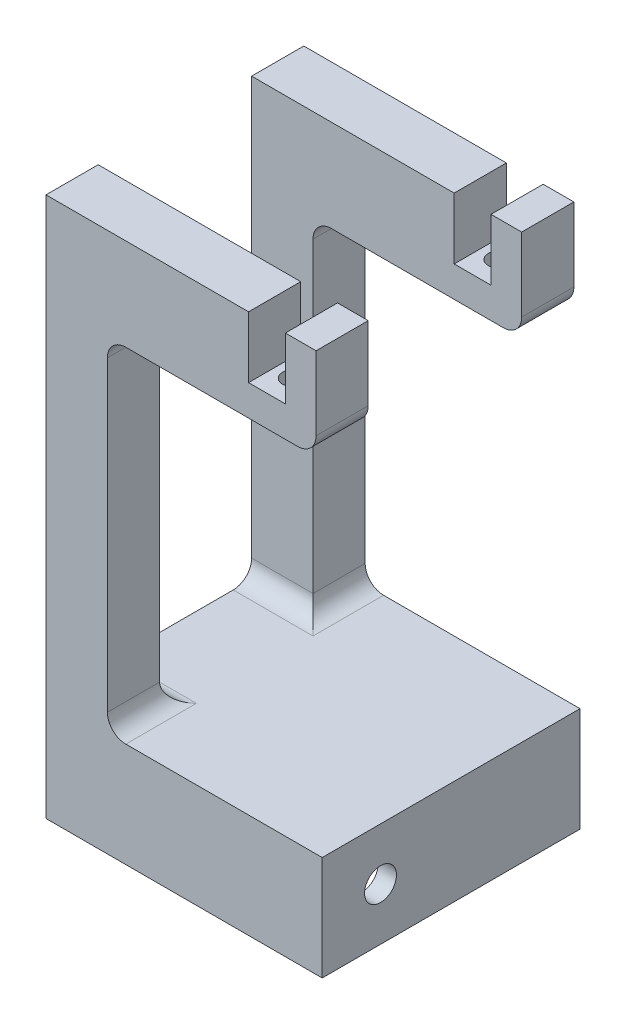
ISO-10303-21;
HEADER;
FILE_DESCRIPTION(('STEP AP214'),'2;1');
FILE_NAME('part.step','',(''),(''),'','','');
FILE_SCHEMA(('AUTOMOTIVE_DESIGN { 1 0 10303 214 1 1 1 1 }'));
ENDSEC;
DATA;
#1=APPLICATION_CONTEXT('core data for automotive mechanical design processes');
#2=APPLICATION_PROTOCOL_DEFINITION('international standard','automotive_design',2000,#1);
#3=PRODUCT_CONTEXT('',#1,'mechanical');
#4=PRODUCT('Part','Part','',(#3));
#5=PRODUCT_RELATED_PRODUCT_CATEGORY('part','',(#4));
#6=PRODUCT_DEFINITION_FORMATION('','',#4);
#7=PRODUCT_DEFINITION_CONTEXT('part definition',#1,'design');
#8=PRODUCT_DEFINITION('design','',#6,#7);
#9=PRODUCT_DEFINITION_SHAPE('','',#8);
#10=(LENGTH_UNIT() NAMED_UNIT(*) SI_UNIT(.MILLI.,.METRE.));
#11=(NAMED_UNIT(*) PLANE_ANGLE_UNIT() SI_UNIT($,.RADIAN.));
#12=(NAMED_UNIT(*) SI_UNIT($,.STERADIAN.) SOLID_ANGLE_UNIT());
#13=UNCERTAINTY_MEASURE_WITH_UNIT(LENGTH_MEASURE(1.E-05),#10,'distance_accuracy_value','');
#14=(GEOMETRIC_REPRESENTATION_CONTEXT(3) GLOBAL_UNCERTAINTY_ASSIGNED_CONTEXT((#13)) GLOBAL_UNIT_ASSIGNED_CONTEXT((#10,
#11,#12)) REPRESENTATION_CONTEXT('',''));
#15=CARTESIAN_POINT('',(0.,0.,0.));
#16=DIRECTION('',(0.,0.,1.));
#17=DIRECTION('',(1.,0.,0.));
#18=AXIS2_PLACEMENT_3D('',#15,#16,#17);
#19=CARTESIAN_POINT('',(10.,17.,42.));
#20=DIRECTION('',(-1.,0.,0.));
#21=DIRECTION('',(0.,0.,1.));
#22=AXIS2_PLACEMENT_3D('',#19,#20,#21);
#23=PLANE('',#22);
#24=DIRECTION('',(0.,1.,0.));
#25=VECTOR('',#24,1.);
#26=CARTESIAN_POINT('',(10.,17.,0.));
#27=LINE('',#26,#25);
#28=CARTESIAN_POINT('',(10.,20.,0.));
#29=VERTEX_POINT('',#28);
#30=CARTESIAN_POINT('',(10.,70.,0.));
#31=VERTEX_POINT('',#30);
#32=EDGE_CURVE('E396',#29,#31,#27,.T.);
#33=ORIENTED_EDGE('',*,*,#32,.T.);
#34=DIRECTION('',(0.,0.,-1.));
#35=VECTOR('',#34,1.);
#36=CARTESIAN_POINT('',(10.,70.,8.50000000000001));
#37=LINE('',#36,#35);
#38=CARTESIAN_POINT('',(10.,70.,8.5));
#39=VERTEX_POINT('',#38);
#40=EDGE_CURVE('E511',#31,#39,#37,.F.);
#41=ORIENTED_EDGE('',*,*,#40,.T.);
#42=DIRECTION('',(0.,-1.,0.));
#43=VECTOR('',#42,1.);
#44=CARTESIAN_POINT('',(10.,17.,8.50000000000001));
#45=LINE('',#44,#43);
#46=CARTESIAN_POINT('',(10.,20.,8.50000000000001));
#47=VERTEX_POINT('',#46);
#48=EDGE_CURVE('E354',#39,#47,#45,.T.);
#49=ORIENTED_EDGE('',*,*,#48,.T.);
#50=DIRECTION('',(0.,0.,-1.));
#51=VECTOR('',#50,1.);
#52=CARTESIAN_POINT('',(10.,20.,0.));
#53=LINE('',#52,#51);
#54=EDGE_CURVE('E472',#47,#29,#53,.T.);
#55=ORIENTED_EDGE('',*,*,#54,.T.);
#56=EDGE_LOOP('',(#33,#41,#49,#55));
#57=FACE_BOUND('',#56,.T.);
#58=ADVANCED_FACE('F39',(#57),#23,.F.);
#59=CARTESIAN_POINT('',(10.,73.,42.));
#60=DIRECTION('',(0.,1.,0.));
#61=DIRECTION('',(0.,0.,1.));
#62=AXIS2_PLACEMENT_3D('',#59,#60,#61);
#63=PLANE('',#62);
#64=CARTESIAN_POINT('',(36.,73.,4.25));
#65=DIRECTION('',(0.,1.,0.));
#66=DIRECTION('',(0.,0.,1.));
#67=AXIS2_PLACEMENT_3D('',#64,#65,#66);
#68=CIRCLE('',#67,1.7);
#69=CARTESIAN_POINT('',(36.,73.,5.95));
#70=VERTEX_POINT('',#69);
#71=EDGE_CURVE('E297',#70,#70,#68,.F.);
#72=ORIENTED_EDGE('',*,*,#71,.F.);
#73=EDGE_LOOP('',(#72));
#74=FACE_BOUND('',#73,.T.);
#75=DIRECTION('',(1.,0.,0.));
#76=VECTOR('',#75,1.);
#77=CARTESIAN_POINT('',(10.,73.,0.));
#78=LINE('',#77,#76);
#79=CARTESIAN_POINT('',(13.,73.,0.));
#80=VERTEX_POINT('',#79);
#81=CARTESIAN_POINT('',(41.,73.,0.));
#82=VERTEX_POINT('',#81);
#83=EDGE_CURVE('E399',#80,#82,#78,.T.);
#84=ORIENTED_EDGE('',*,*,#83,.T.);
#85=DIRECTION('',(0.,0.,-1.));
#86=VECTOR('',#85,1.);
#87=CARTESIAN_POINT('',(41.,73.,42.));
#88=LINE('',#87,#86);
#89=CARTESIAN_POINT('',(41.,73.,8.50000000000001));
#90=VERTEX_POINT('',#89);
#91=EDGE_CURVE('E494',#82,#90,#88,.F.);
#92=ORIENTED_EDGE('',*,*,#91,.T.);
#93=DIRECTION('',(-1.,0.,0.));
#94=VECTOR('',#93,1.);
#95=CARTESIAN_POINT('',(10.,73.,8.50000000000001));
#96=LINE('',#95,#94);
#97=CARTESIAN_POINT('',(13.,73.,8.50000000000001));
#98=VERTEX_POINT('',#97);
#99=EDGE_CURVE('E351',#90,#98,#96,.T.);
#100=ORIENTED_EDGE('',*,*,#99,.T.);
#101=DIRECTION('',(0.,0.,-1.));
#102=VECTOR('',#101,1.);
#103=CARTESIAN_POINT('',(13.,73.,0.));
#104=LINE('',#103,#102);
#105=EDGE_CURVE('E491',#98,#80,#104,.T.);
#106=ORIENTED_EDGE('',*,*,#105,.T.);
#107=EDGE_LOOP('',(#84,#92,#100,#106));
#108=FACE_BOUND('',#107,.T.);
#109=ADVANCED_FACE('F535',(#74,#108),#63,.F.);
#110=CARTESIAN_POINT('',(44.,88.,42.));
#111=DIRECTION('',(-1.,0.,0.));
#112=DIRECTION('',(0.,0.,1.));
#113=AXIS2_PLACEMENT_3D('',#110,#111,#112);
#114=PLANE('',#113);
#115=DIRECTION('',(0.,-1.,0.));
#116=VECTOR('',#115,1.);
#117=CARTESIAN_POINT('',(44.,88.,8.50000000000001));
#118=LINE('',#117,#116);
#119=CARTESIAN_POINT('',(44.,88.,8.5));
#120=VERTEX_POINT('',#119);
#121=CARTESIAN_POINT('',(44.,76.,8.50000000000001));
#122=VERTEX_POINT('',#121);
#123=EDGE_CURVE('E348',#120,#122,#118,.T.);
#124=ORIENTED_EDGE('',*,*,#123,.T.);
#125=DIRECTION('',(0.,0.,-1.));
#126=VECTOR('',#125,1.);
#127=CARTESIAN_POINT('',(44.,76.,42.));
#128=LINE('',#127,#126);
#129=CARTESIAN_POINT('',(44.,76.,0.));
#130=VERTEX_POINT('',#129);
#131=EDGE_CURVE('E482',#122,#130,#128,.T.);
#132=ORIENTED_EDGE('',*,*,#131,.T.);
#133=DIRECTION('',(0.,1.,0.));
#134=VECTOR('',#133,1.);
#135=CARTESIAN_POINT('',(44.,88.,0.));
#136=LINE('',#135,#134);
#137=CARTESIAN_POINT('',(44.,88.,0.));
#138=VERTEX_POINT('',#137);
#139=EDGE_CURVE('E402',#130,#138,#136,.T.);
#140=ORIENTED_EDGE('',*,*,#139,.T.);
#141=DIRECTION('',(0.,0.,-1.));
#142=VECTOR('',#141,1.);
#143=CARTESIAN_POINT('',(44.,88.,42.));
#144=LINE('',#143,#142);
#145=EDGE_CURVE('E437',#120,#138,#144,.T.);
#146=ORIENTED_EDGE('',*,*,#145,.F.);
#147=EDGE_LOOP('',(#124,#132,#140,#146));
#148=FACE_BOUND('',#147,.T.);
#149=ADVANCED_FACE('F543',(#148),#114,.F.);
#150=CARTESIAN_POINT('',(39.,88.,42.));
#151=DIRECTION('',(0.,-1.,0.));
#152=DIRECTION('',(0.,0.,-1.));
#153=AXIS2_PLACEMENT_3D('',#150,#151,#152);
#154=PLANE('',#153);
#155=DIRECTION('',(0.,0.,-1.));
#156=VECTOR('',#155,1.);
#157=CARTESIAN_POINT('',(39.,88.,42.));
#158=LINE('',#157,#156);
#159=CARTESIAN_POINT('',(39.,88.,8.5));
#160=VERTEX_POINT('',#159);
#161=CARTESIAN_POINT('',(39.,88.,0.));
#162=VERTEX_POINT('',#161);
#163=EDGE_CURVE('E433',#160,#162,#158,.T.);
#164=ORIENTED_EDGE('',*,*,#163,.F.);
#165=DIRECTION('',(-1.,0.,0.));
#166=VECTOR('',#165,1.);
#167=CARTESIAN_POINT('',(45.,88.,8.5));
#168=LINE('',#167,#166);
#169=EDGE_CURVE('E319',#120,#160,#168,.T.);
#170=ORIENTED_EDGE('',*,*,#169,.F.);
#171=ORIENTED_EDGE('',*,*,#145,.T.);
#172=DIRECTION('',(-1.,0.,0.));
#173=VECTOR('',#172,1.);
#174=CARTESIAN_POINT('',(39.,88.,0.));
#175=LINE('',#174,#173);
#176=EDGE_CURVE('E404',#138,#162,#175,.T.);
#177=ORIENTED_EDGE('',*,*,#176,.T.);
#178=EDGE_LOOP('',(#164,#170,#171,#177));
#179=FACE_BOUND('',#178,.T.);
#180=ADVANCED_FACE('F548',(#179),#154,.F.);
#181=CARTESIAN_POINT('',(39.,88.,42.));
#182=DIRECTION('',(1.,0.,0.));
#183=DIRECTION('',(0.,0.,-1.));
#184=AXIS2_PLACEMENT_3D('',#181,#182,#183);
#185=PLANE('',#184);
#186=DIRECTION('',(0.,0.,-1.));
#187=VECTOR('',#186,1.);
#188=CARTESIAN_POINT('',(39.,78.,42.));
#189=LINE('',#188,#187);
#190=CARTESIAN_POINT('',(39.,78.,8.50000000000001));
#191=VERTEX_POINT('',#190);
#192=CARTESIAN_POINT('',(39.,78.,0.));
#193=VERTEX_POINT('',#192);
#194=EDGE_CURVE('E429',#191,#193,#189,.T.);
#195=ORIENTED_EDGE('',*,*,#194,.F.);
#196=DIRECTION('',(0.,1.,0.));
#197=VECTOR('',#196,1.);
#198=CARTESIAN_POINT('',(39.,88.,8.50000000000001));
#199=LINE('',#198,#197);
#200=EDGE_CURVE('E345',#191,#160,#199,.T.);
#201=ORIENTED_EDGE('',*,*,#200,.T.);
#202=ORIENTED_EDGE('',*,*,#163,.T.);
#203=DIRECTION('',(0.,-1.,0.));
#204=VECTOR('',#203,1.);
#205=CARTESIAN_POINT('',(39.,88.,0.));
#206=LINE('',#205,#204);
#207=EDGE_CURVE('E407',#162,#193,#206,.T.);
#208=ORIENTED_EDGE('',*,*,#207,.T.);
#209=EDGE_LOOP('',(#195,#201,#202,#208));
#210=FACE_BOUND('',#209,.T.);
#211=ADVANCED_FACE('F554',(#210),#185,.F.);
#212=CARTESIAN_POINT('',(33.,78.,42.));
#213=DIRECTION('',(0.,-1.,0.));
#214=DIRECTION('',(0.,0.,-1.));
#215=AXIS2_PLACEMENT_3D('',#212,#213,#214);
#216=PLANE('',#215);
#217=CARTESIAN_POINT('',(36.,78.,4.25));
#218=DIRECTION('',(0.,1.,0.));
#219=DIRECTION('',(0.,0.,-1.));
#220=AXIS2_PLACEMENT_3D('',#217,#218,#219);
#221=CIRCLE('',#220,1.7);
#222=CARTESIAN_POINT('',(36.,78.,2.55));
#223=VERTEX_POINT('',#222);
#224=EDGE_CURVE('E303',#223,#223,#221,.T.);
#225=ORIENTED_EDGE('',*,*,#224,.F.);
#226=EDGE_LOOP('',(#225));
#227=FACE_BOUND('',#226,.T.);
#228=DIRECTION('',(0.,0.,-1.));
#229=VECTOR('',#228,1.);
#230=CARTESIAN_POINT('',(33.,78.,42.));
#231=LINE('',#230,#229);
#232=CARTESIAN_POINT('',(33.,78.,8.50000000000001));
#233=VERTEX_POINT('',#232);
#234=CARTESIAN_POINT('',(33.,78.,0.));
#235=VERTEX_POINT('',#234);
#236=EDGE_CURVE('E425',#233,#235,#231,.T.);
#237=ORIENTED_EDGE('',*,*,#236,.F.);
#238=DIRECTION('',(1.,0.,0.));
#239=VECTOR('',#238,1.);
#240=CARTESIAN_POINT('',(33.,78.,8.50000000000001));
#241=LINE('',#240,#239);
#242=EDGE_CURVE('E342',#233,#191,#241,.T.);
#243=ORIENTED_EDGE('',*,*,#242,.T.);
#244=ORIENTED_EDGE('',*,*,#194,.T.);
#245=DIRECTION('',(-1.,0.,0.));
#246=VECTOR('',#245,1.);
#247=CARTESIAN_POINT('',(33.,78.,0.));
#248=LINE('',#247,#246);
#249=EDGE_CURVE('E410',#193,#235,#248,.T.);
#250=ORIENTED_EDGE('',*,*,#249,.T.);
#251=EDGE_LOOP('',(#237,#243,#244,#250));
#252=FACE_BOUND('',#251,.T.);
#253=ADVANCED_FACE('F557',(#227,#252),#216,.F.);
#254=CARTESIAN_POINT('',(33.,88.,42.));
#255=DIRECTION('',(-1.,0.,0.));
#256=DIRECTION('',(0.,0.,1.));
#257=AXIS2_PLACEMENT_3D('',#254,#255,#256);
#258=PLANE('',#257);
#259=DIRECTION('',(0.,0.,-1.));
#260=VECTOR('',#259,1.);
#261=CARTESIAN_POINT('',(33.,88.,42.));
#262=LINE('',#261,#260);
#263=CARTESIAN_POINT('',(33.,88.,8.5));
#264=VERTEX_POINT('',#263);
#265=CARTESIAN_POINT('',(33.,88.,0.));
#266=VERTEX_POINT('',#265);
#267=EDGE_CURVE('E421',#264,#266,#262,.T.);
#268=ORIENTED_EDGE('',*,*,#267,.F.);
#269=DIRECTION('',(0.,-1.,0.));
#270=VECTOR('',#269,1.);
#271=CARTESIAN_POINT('',(33.,88.,8.50000000000001));
#272=LINE('',#271,#270);
#273=EDGE_CURVE('E339',#264,#233,#272,.T.);
#274=ORIENTED_EDGE('',*,*,#273,.T.);
#275=ORIENTED_EDGE('',*,*,#236,.T.);
#276=DIRECTION('',(0.,1.,0.));
#277=VECTOR('',#276,1.);
#278=CARTESIAN_POINT('',(33.,88.,0.));
#279=LINE('',#278,#277);
#280=EDGE_CURVE('E413',#235,#266,#279,.T.);
#281=ORIENTED_EDGE('',*,*,#280,.T.);
#282=EDGE_LOOP('',(#268,#274,#275,#281));
#283=FACE_BOUND('',#282,.T.);
#284=ADVANCED_FACE('F560',(#283),#258,.F.);
#285=CARTESIAN_POINT('',(0.,88.,42.));
#286=DIRECTION('',(0.,-1.,0.));
#287=DIRECTION('',(0.,0.,-1.));
#288=AXIS2_PLACEMENT_3D('',#285,#286,#287);
#289=PLANE('',#288);
#290=DIRECTION('',(0.,0.,-1.));
#291=VECTOR('',#290,1.);
#292=CARTESIAN_POINT('',(0.,88.,42.));
#293=LINE('',#292,#291);
#294=CARTESIAN_POINT('',(0.,88.,8.5));
#295=VERTEX_POINT('',#294);
#296=CARTESIAN_POINT('',(0.,88.,0.));
#297=VERTEX_POINT('',#296);
#298=EDGE_CURVE('E385',#295,#297,#293,.T.);
#299=ORIENTED_EDGE('',*,*,#298,.F.);
#300=DIRECTION('',(1.,0.,0.));
#301=VECTOR('',#300,1.);
#302=CARTESIAN_POINT('',(0.,88.,8.50000000000001));
#303=LINE('',#302,#301);
#304=EDGE_CURVE('E452',#295,#264,#303,.T.);
#305=ORIENTED_EDGE('',*,*,#304,.T.);
#306=ORIENTED_EDGE('',*,*,#267,.T.);
#307=DIRECTION('',(-1.,0.,0.));
#308=VECTOR('',#307,1.);
#309=CARTESIAN_POINT('',(0.,88.,0.));
#310=LINE('',#309,#308);
#311=EDGE_CURVE('E361',#266,#297,#310,.T.);
#312=ORIENTED_EDGE('',*,*,#311,.T.);
#313=EDGE_LOOP('',(#299,#305,#306,#312));
#314=FACE_BOUND('',#313,.T.);
#315=ADVANCED_FACE('F565',(#314),#289,.F.);
#316=CARTESIAN_POINT('',(0.,0.,42.));
#317=DIRECTION('',(1.,0.,0.));
#318=DIRECTION('',(0.,0.,-1.));
#319=AXIS2_PLACEMENT_3D('',#316,#317,#318);
#320=PLANE('',#319);
#321=DIRECTION('',(0.,0.,1.));
#322=VECTOR('',#321,1.);
#323=CARTESIAN_POINT('',(0.,17.,8.50000000000001));
#324=LINE('',#323,#322);
#325=CARTESIAN_POINT('',(0.,17.,11.5));
#326=VERTEX_POINT('',#325);
#327=CARTESIAN_POINT('',(0.,17.,30.5));
#328=VERTEX_POINT('',#327);
#329=EDGE_CURVE('E313',#326,#328,#324,.T.);
#330=ORIENTED_EDGE('',*,*,#329,.F.);
#331=CARTESIAN_POINT('',(0.,20.,11.5));
#332=DIRECTION('',(1.,0.,0.));
#333=DIRECTION('',(0.,0.,-1.));
#334=AXIS2_PLACEMENT_3D('',#331,#332,#333);
#335=CIRCLE('',#334,3.);
#336=CARTESIAN_POINT('',(0.,20.,8.50000000000001));
#337=VERTEX_POINT('',#336);
#338=EDGE_CURVE('E478',#326,#337,#335,.T.);
#339=ORIENTED_EDGE('',*,*,#338,.T.);
#340=DIRECTION('',(0.,-1.,0.));
#341=VECTOR('',#340,1.);
#342=CARTESIAN_POINT('',(0.,88.,8.5));
#343=LINE('',#342,#341);
#344=EDGE_CURVE('E306',#295,#337,#343,.T.);
#345=ORIENTED_EDGE('',*,*,#344,.F.);
#346=ORIENTED_EDGE('',*,*,#298,.T.);
#347=DIRECTION('',(0.,-1.,0.));
#348=VECTOR('',#347,1.);
#349=CARTESIAN_POINT('',(0.,0.,0.));
#350=LINE('',#349,#348);
#351=CARTESIAN_POINT('',(0.,0.,0.));
#352=VERTEX_POINT('',#351);
#353=EDGE_CURVE('E356',#297,#352,#350,.T.);
#354=ORIENTED_EDGE('',*,*,#353,.T.);
#355=DIRECTION('',(0.,0.,-1.));
#356=VECTOR('',#355,1.);
#357=CARTESIAN_POINT('',(0.,0.,42.));
#358=LINE('',#357,#356);
#359=CARTESIAN_POINT('',(0.,0.,42.));
#360=VERTEX_POINT('',#359);
#361=EDGE_CURVE('E446',#360,#352,#358,.T.);
#362=ORIENTED_EDGE('',*,*,#361,.F.);
#363=DIRECTION('',(0.,-1.,0.));
#364=VECTOR('',#363,1.);
#365=CARTESIAN_POINT('',(0.,0.,42.));
#366=LINE('',#365,#364);
#367=CARTESIAN_POINT('',(0.,88.,42.));
#368=VERTEX_POINT('',#367);
#369=EDGE_CURVE('E357',#368,#360,#366,.T.);
#370=ORIENTED_EDGE('',*,*,#369,.F.);
#371=CARTESIAN_POINT('',(0.,88.,33.5));
#372=VERTEX_POINT('',#371);
#373=EDGE_CURVE('E418',#368,#372,#293,.T.);
#374=ORIENTED_EDGE('',*,*,#373,.T.);
#375=DIRECTION('',(0.,1.,0.));
#376=VECTOR('',#375,1.);
#377=CARTESIAN_POINT('',(0.,88.,33.5));
#378=LINE('',#377,#376);
#379=CARTESIAN_POINT('',(0.,20.,33.5));
#380=VERTEX_POINT('',#379);
#381=EDGE_CURVE('E316',#380,#372,#378,.T.);
#382=ORIENTED_EDGE('',*,*,#381,.F.);
#383=CARTESIAN_POINT('',(0.,20.,30.5));
#384=DIRECTION('',(1.,0.,0.));
#385=DIRECTION('',(0.,0.,-1.));
#386=AXIS2_PLACEMENT_3D('',#383,#384,#385);
#387=CIRCLE('',#386,3.);
#388=EDGE_CURVE('E476',#380,#328,#387,.T.);
#389=ORIENTED_EDGE('',*,*,#388,.T.);
#390=EDGE_LOOP('',(#330,#339,#345,#346,#354,#362,#370,#374,#382,#389));
#391=FACE_BOUND('',#390,.T.);
#392=ADVANCED_FACE('F569',(#391),#320,.F.);
#393=CARTESIAN_POINT('',(0.,0.,42.));
#394=DIRECTION('',(0.,1.,0.));
#395=DIRECTION('',(0.,0.,1.));
#396=AXIS2_PLACEMENT_3D('',#393,#394,#395);
#397=PLANE('',#396);
#398=DIRECTION('',(1.,0.,0.));
#399=VECTOR('',#398,1.);
#400=CARTESIAN_POINT('',(3.,0.,3.));
#401=LINE('',#400,#399);
#402=CARTESIAN_POINT('',(3.,0.,3.));
#403=VERTEX_POINT('',#402);
#404=CARTESIAN_POINT('',(42.,0.,3.));
#405=VERTEX_POINT('',#404);
#406=EDGE_CURVE('E285',#403,#405,#401,.T.);
#407=ORIENTED_EDGE('',*,*,#406,.F.);
#408=DIRECTION('',(0.,0.,-1.));
#409=VECTOR('',#408,1.);
#410=CARTESIAN_POINT('',(3.,0.,39.));
#411=LINE('',#410,#409);
#412=CARTESIAN_POINT('',(3.,0.,39.));
#413=VERTEX_POINT('',#412);
#414=EDGE_CURVE('E55',#413,#403,#411,.T.);
#415=ORIENTED_EDGE('',*,*,#414,.F.);
#416=DIRECTION('',(-1.,0.,0.));
#417=VECTOR('',#416,1.);
#418=CARTESIAN_POINT('',(42.,0.,39.));
#419=LINE('',#418,#417);
#420=CARTESIAN_POINT('',(42.,0.,39.));
#421=VERTEX_POINT('',#420);
#422=EDGE_CURVE('E276',#421,#413,#419,.T.);
#423=ORIENTED_EDGE('',*,*,#422,.F.);
#424=DIRECTION('',(0.,0.,1.));
#425=VECTOR('',#424,1.);
#426=CARTESIAN_POINT('',(42.,0.,3.));
#427=LINE('',#426,#425);
#428=EDGE_CURVE('E279',#405,#421,#427,.T.);
#429=ORIENTED_EDGE('',*,*,#428,.F.);
#430=EDGE_LOOP('',(#407,#415,#423,#429));
#431=FACE_BOUND('',#430,.T.);
#432=DIRECTION('',(1.,0.,0.));
#433=VECTOR('',#432,1.);
#434=CARTESIAN_POINT('',(0.,0.,0.));
#435=LINE('',#434,#433);
#436=CARTESIAN_POINT('',(45.,0.,0.));
#437=VERTEX_POINT('',#436);
#438=EDGE_CURVE('E388',#352,#437,#435,.T.);
#439=ORIENTED_EDGE('',*,*,#438,.T.);
#440=DIRECTION('',(0.,0.,-1.));
#441=VECTOR('',#440,1.);
#442=CARTESIAN_POINT('',(45.,0.,42.));
#443=LINE('',#442,#441);
#444=CARTESIAN_POINT('',(45.,0.,42.));
#445=VERTEX_POINT('',#444);
#446=EDGE_CURVE('E443',#445,#437,#443,.T.);
#447=ORIENTED_EDGE('',*,*,#446,.F.);
#448=DIRECTION('',(1.,0.,0.));
#449=VECTOR('',#448,1.);
#450=CARTESIAN_POINT('',(0.,0.,42.));
#451=LINE('',#450,#449);
#452=EDGE_CURVE('E360',#360,#445,#451,.T.);
#453=ORIENTED_EDGE('',*,*,#452,.F.);
#454=ORIENTED_EDGE('',*,*,#361,.T.);
#455=EDGE_LOOP('',(#439,#447,#453,#454));
#456=FACE_BOUND('',#455,.T.);
#457=ADVANCED_FACE('F590',(#431,#456),#397,.F.);
#458=CARTESIAN_POINT('',(45.,17.,42.));
#459=DIRECTION('',(-1.,0.,0.));
#460=DIRECTION('',(0.,0.,1.));
#461=AXIS2_PLACEMENT_3D('',#458,#459,#460);
#462=PLANE('',#461);
#463=CARTESIAN_POINT('',(45.,8.5,32.5));
#464=DIRECTION('',(1.,0.,0.));
#465=DIRECTION('',(0.,0.,-1.));
#466=AXIS2_PLACEMENT_3D('',#463,#464,#465);
#467=CIRCLE('',#466,2.6);
#468=CARTESIAN_POINT('',(45.,8.5,29.9));
#469=VERTEX_POINT('',#468);
#470=EDGE_CURVE('E294',#469,#469,#467,.T.);
#471=ORIENTED_EDGE('',*,*,#470,.F.);
#472=EDGE_LOOP('',(#471));
#473=FACE_BOUND('',#472,.T.);
#474=DIRECTION('',(0.,1.,0.));
#475=VECTOR('',#474,1.);
#476=CARTESIAN_POINT('',(45.,17.,0.));
#477=LINE('',#476,#475);
#478=CARTESIAN_POINT('',(45.,17.,0.));
#479=VERTEX_POINT('',#478);
#480=EDGE_CURVE('E390',#437,#479,#477,.T.);
#481=ORIENTED_EDGE('',*,*,#480,.T.);
#482=DIRECTION('',(0.,0.,-1.));
#483=VECTOR('',#482,1.);
#484=CARTESIAN_POINT('',(45.,17.,42.));
#485=LINE('',#484,#483);
#486=CARTESIAN_POINT('',(45.,17.,42.));
#487=VERTEX_POINT('',#486);
#488=EDGE_CURVE('E441',#487,#479,#485,.T.);
#489=ORIENTED_EDGE('',*,*,#488,.F.);
#490=DIRECTION('',(0.,1.,0.));
#491=VECTOR('',#490,1.);
#492=CARTESIAN_POINT('',(45.,17.,42.));
#493=LINE('',#492,#491);
#494=EDGE_CURVE('E363',#445,#487,#493,.T.);
#495=ORIENTED_EDGE('',*,*,#494,.F.);
#496=ORIENTED_EDGE('',*,*,#446,.T.);
#497=EDGE_LOOP('',(#481,#489,#495,#496));
#498=FACE_BOUND('',#497,.T.);
#499=ADVANCED_FACE('F587',(#473,#498),#462,.F.);
#500=CARTESIAN_POINT('',(10.,17.,42.));
#501=DIRECTION('',(0.,-1.,0.));
#502=DIRECTION('',(0.,0.,-1.));
#503=AXIS2_PLACEMENT_3D('',#500,#501,#502);
#504=PLANE('',#503);
#505=DIRECTION('',(-1.,0.,0.));
#506=VECTOR('',#505,1.);
#507=CARTESIAN_POINT('',(10.,17.,30.5));
#508=LINE('',#507,#506);
#509=CARTESIAN_POINT('',(13.,17.,30.5));
#510=VERTEX_POINT('',#509);
#511=EDGE_CURVE('E463',#328,#510,#508,.F.);
#512=ORIENTED_EDGE('',*,*,#511,.T.);
#513=DIRECTION('',(0.,0.,-1.));
#514=VECTOR('',#513,1.);
#515=CARTESIAN_POINT('',(13.,17.,42.));
#516=LINE('',#515,#514);
#517=CARTESIAN_POINT('',(13.,17.,42.));
#518=VERTEX_POINT('',#517);
#519=EDGE_CURVE('E465',#510,#518,#516,.F.);
#520=ORIENTED_EDGE('',*,*,#519,.T.);
#521=DIRECTION('',(-1.,0.,0.));
#522=VECTOR('',#521,1.);
#523=CARTESIAN_POINT('',(10.,17.,42.));
#524=LINE('',#523,#522);
#525=EDGE_CURVE('E365',#487,#518,#524,.T.);
#526=ORIENTED_EDGE('',*,*,#525,.F.);
#527=ORIENTED_EDGE('',*,*,#488,.T.);
#528=DIRECTION('',(-1.,0.,0.));
#529=VECTOR('',#528,1.);
#530=CARTESIAN_POINT('',(10.,17.,0.));
#531=LINE('',#530,#529);
#532=CARTESIAN_POINT('',(13.,17.,0.));
#533=VERTEX_POINT('',#532);
#534=EDGE_CURVE('E393',#479,#533,#531,.T.);
#535=ORIENTED_EDGE('',*,*,#534,.T.);
#536=DIRECTION('',(0.,0.,-1.));
#537=VECTOR('',#536,1.);
#538=CARTESIAN_POINT('',(13.,17.,8.50000000000001));
#539=LINE('',#538,#537);
#540=CARTESIAN_POINT('',(13.,17.,11.5));
#541=VERTEX_POINT('',#540);
#542=EDGE_CURVE('E458',#533,#541,#539,.F.);
#543=ORIENTED_EDGE('',*,*,#542,.T.);
#544=DIRECTION('',(-1.,0.,0.));
#545=VECTOR('',#544,1.);
#546=CARTESIAN_POINT('',(0.,17.,11.5));
#547=LINE('',#546,#545);
#548=EDGE_CURVE('E460',#541,#326,#547,.T.);
#549=ORIENTED_EDGE('',*,*,#548,.T.);
#550=ORIENTED_EDGE('',*,*,#329,.T.);
#551=EDGE_LOOP('',(#512,#520,#526,#527,#535,#543,#549,#550));
#552=FACE_BOUND('',#551,.T.);
#553=ADVANCED_FACE('F582',(#552),#504,.F.);
#554=DIRECTION('',(0.,1.,0.));
#555=VECTOR('',#554,1.);
#556=CARTESIAN_POINT('',(10.,17.,33.5));
#557=LINE('',#556,#555);
#558=CARTESIAN_POINT('',(10.,20.,33.5));
#559=VERTEX_POINT('',#558);
#560=CARTESIAN_POINT('',(10.,70.,33.5));
#561=VERTEX_POINT('',#560);
#562=EDGE_CURVE('E337',#559,#561,#557,.T.);
#563=ORIENTED_EDGE('',*,*,#562,.T.);
#564=DIRECTION('',(0.,0.,-1.));
#565=VECTOR('',#564,1.);
#566=CARTESIAN_POINT('',(10.,70.,42.));
#567=LINE('',#566,#565);
#568=CARTESIAN_POINT('',(10.,70.,42.));
#569=VERTEX_POINT('',#568);
#570=EDGE_CURVE('E63',#561,#569,#567,.F.);
#571=ORIENTED_EDGE('',*,*,#570,.T.);
#572=DIRECTION('',(0.,1.,0.));
#573=VECTOR('',#572,1.);
#574=CARTESIAN_POINT('',(10.,17.,42.));
#575=LINE('',#574,#573);
#576=CARTESIAN_POINT('',(10.,20.,42.));
#577=VERTEX_POINT('',#576);
#578=EDGE_CURVE('E368',#577,#569,#575,.T.);
#579=ORIENTED_EDGE('',*,*,#578,.F.);
#580=DIRECTION('',(0.,0.,-1.));
#581=VECTOR('',#580,1.);
#582=CARTESIAN_POINT('',(10.,20.,33.5));
#583=LINE('',#582,#581);
#584=EDGE_CURVE('E455',#577,#559,#583,.T.);
#585=ORIENTED_EDGE('',*,*,#584,.T.);
#586=EDGE_LOOP('',(#563,#571,#579,#585));
#587=FACE_BOUND('',#586,.T.);
#588=ADVANCED_FACE('F637',(#587),#23,.F.);
#589=CARTESIAN_POINT('',(36.,73.,37.75));
#590=DIRECTION('',(0.,1.,0.));
#591=DIRECTION('',(0.,0.,1.));
#592=AXIS2_PLACEMENT_3D('',#589,#590,#591);
#593=CIRCLE('',#592,1.7);
#594=CARTESIAN_POINT('',(36.,73.,39.45));
#595=VERTEX_POINT('',#594);
#596=EDGE_CURVE('E299',#595,#595,#593,.F.);
#597=ORIENTED_EDGE('',*,*,#596,.F.);
#598=EDGE_LOOP('',(#597));
#599=FACE_BOUND('',#598,.T.);
#600=DIRECTION('',(1.,0.,0.));
#601=VECTOR('',#600,1.);
#602=CARTESIAN_POINT('',(10.,73.,33.5));
#603=LINE('',#602,#601);
#604=CARTESIAN_POINT('',(13.,73.,33.5));
#605=VERTEX_POINT('',#604);
#606=CARTESIAN_POINT('',(41.,73.,33.5));
#607=VERTEX_POINT('',#606);
#608=EDGE_CURVE('E334',#605,#607,#603,.T.);
#609=ORIENTED_EDGE('',*,*,#608,.T.);
#610=DIRECTION('',(0.,0.,-1.));
#611=VECTOR('',#610,1.);
#612=CARTESIAN_POINT('',(41.,73.,42.));
#613=LINE('',#612,#611);
#614=CARTESIAN_POINT('',(41.,73.,42.));
#615=VERTEX_POINT('',#614);
#616=EDGE_CURVE('E506',#607,#615,#613,.F.);
#617=ORIENTED_EDGE('',*,*,#616,.T.);
#618=DIRECTION('',(1.,0.,0.));
#619=VECTOR('',#618,1.);
#620=CARTESIAN_POINT('',(10.,73.,42.));
#621=LINE('',#620,#619);
#622=CARTESIAN_POINT('',(13.,73.,42.));
#623=VERTEX_POINT('',#622);
#624=EDGE_CURVE('E370',#623,#615,#621,.T.);
#625=ORIENTED_EDGE('',*,*,#624,.F.);
#626=DIRECTION('',(0.,0.,-1.));
#627=VECTOR('',#626,1.);
#628=CARTESIAN_POINT('',(13.,73.,33.5));
#629=LINE('',#628,#627);
#630=EDGE_CURVE('E503',#623,#605,#629,.T.);
#631=ORIENTED_EDGE('',*,*,#630,.T.);
#632=EDGE_LOOP('',(#609,#617,#625,#631));
#633=FACE_BOUND('',#632,.T.);
#634=ADVANCED_FACE('F631',(#599,#633),#63,.F.);
#635=DIRECTION('',(0.,1.,0.));
#636=VECTOR('',#635,1.);
#637=CARTESIAN_POINT('',(44.,88.,42.));
#638=LINE('',#637,#636);
#639=CARTESIAN_POINT('',(44.,76.,42.));
#640=VERTEX_POINT('',#639);
#641=CARTESIAN_POINT('',(44.,88.,42.));
#642=VERTEX_POINT('',#641);
#643=EDGE_CURVE('E373',#640,#642,#638,.T.);
#644=ORIENTED_EDGE('',*,*,#643,.F.);
#645=DIRECTION('',(0.,0.,-1.));
#646=VECTOR('',#645,1.);
#647=CARTESIAN_POINT('',(44.,76.,42.));
#648=LINE('',#647,#646);
#649=CARTESIAN_POINT('',(44.,76.,33.5));
#650=VERTEX_POINT('',#649);
#651=EDGE_CURVE('E498',#640,#650,#648,.T.);
#652=ORIENTED_EDGE('',*,*,#651,.T.);
#653=DIRECTION('',(0.,1.,0.));
#654=VECTOR('',#653,1.);
#655=CARTESIAN_POINT('',(44.,88.,33.5));
#656=LINE('',#655,#654);
#657=CARTESIAN_POINT('',(44.,88.,33.5));
#658=VERTEX_POINT('',#657);
#659=EDGE_CURVE('E332',#650,#658,#656,.T.);
#660=ORIENTED_EDGE('',*,*,#659,.T.);
#661=EDGE_CURVE('E438',#642,#658,#144,.T.);
#662=ORIENTED_EDGE('',*,*,#661,.F.);
#663=EDGE_LOOP('',(#644,#652,#660,#662));
#664=FACE_BOUND('',#663,.T.);
#665=ADVANCED_FACE('F623',(#664),#114,.F.);
#666=ORIENTED_EDGE('',*,*,#661,.T.);
#667=DIRECTION('',(-1.,0.,0.));
#668=VECTOR('',#667,1.);
#669=CARTESIAN_POINT('',(45.,88.,33.5));
#670=LINE('',#669,#668);
#671=CARTESIAN_POINT('',(39.,88.,33.5));
#672=VERTEX_POINT('',#671);
#673=EDGE_CURVE('E318',#658,#672,#670,.T.);
#674=ORIENTED_EDGE('',*,*,#673,.T.);
#675=CARTESIAN_POINT('',(39.,88.,42.));
#676=VERTEX_POINT('',#675);
#677=EDGE_CURVE('E434',#676,#672,#158,.T.);
#678=ORIENTED_EDGE('',*,*,#677,.F.);
#679=DIRECTION('',(-1.,0.,0.));
#680=VECTOR('',#679,1.);
#681=CARTESIAN_POINT('',(39.,88.,42.));
#682=LINE('',#681,#680);
#683=EDGE_CURVE('E375',#642,#676,#682,.T.);
#684=ORIENTED_EDGE('',*,*,#683,.F.);
#685=EDGE_LOOP('',(#666,#674,#678,#684));
#686=FACE_BOUND('',#685,.T.);
#687=ADVANCED_FACE('F618',(#686),#154,.F.);
#688=ORIENTED_EDGE('',*,*,#677,.T.);
#689=DIRECTION('',(0.,-1.,0.));
#690=VECTOR('',#689,1.);
#691=CARTESIAN_POINT('',(39.,88.,33.5));
#692=LINE('',#691,#690);
#693=CARTESIAN_POINT('',(39.,78.,33.5));
#694=VERTEX_POINT('',#693);
#695=EDGE_CURVE('E329',#672,#694,#692,.T.);
#696=ORIENTED_EDGE('',*,*,#695,.T.);
#697=CARTESIAN_POINT('',(39.,78.,42.));
#698=VERTEX_POINT('',#697);
#699=EDGE_CURVE('E430',#698,#694,#189,.T.);
#700=ORIENTED_EDGE('',*,*,#699,.F.);
#701=DIRECTION('',(0.,-1.,0.));
#702=VECTOR('',#701,1.);
#703=CARTESIAN_POINT('',(39.,88.,42.));
#704=LINE('',#703,#702);
#705=EDGE_CURVE('E377',#676,#698,#704,.T.);
#706=ORIENTED_EDGE('',*,*,#705,.F.);
#707=EDGE_LOOP('',(#688,#696,#700,#706));
#708=FACE_BOUND('',#707,.T.);
#709=ADVANCED_FACE('F613',(#708),#185,.F.);
#710=CARTESIAN_POINT('',(36.,78.,37.75));
#711=DIRECTION('',(0.,1.,0.));
#712=DIRECTION('',(0.,0.,1.));
#713=AXIS2_PLACEMENT_3D('',#710,#711,#712);
#714=CIRCLE('',#713,1.7);
#715=CARTESIAN_POINT('',(36.,78.,39.45));
#716=VERTEX_POINT('',#715);
#717=EDGE_CURVE('E302',#716,#716,#714,.T.);
#718=ORIENTED_EDGE('',*,*,#717,.F.);
#719=EDGE_LOOP('',(#718));
#720=FACE_BOUND('',#719,.T.);
#721=ORIENTED_EDGE('',*,*,#699,.T.);
#722=DIRECTION('',(-1.,0.,0.));
#723=VECTOR('',#722,1.);
#724=CARTESIAN_POINT('',(33.,78.,33.5));
#725=LINE('',#724,#723);
#726=CARTESIAN_POINT('',(33.,78.,33.5));
#727=VERTEX_POINT('',#726);
#728=EDGE_CURVE('E326',#694,#727,#725,.T.);
#729=ORIENTED_EDGE('',*,*,#728,.T.);
#730=CARTESIAN_POINT('',(33.,78.,42.));
#731=VERTEX_POINT('',#730);
#732=EDGE_CURVE('E426',#731,#727,#231,.T.);
#733=ORIENTED_EDGE('',*,*,#732,.F.);
#734=DIRECTION('',(-1.,0.,0.));
#735=VECTOR('',#734,1.);
#736=CARTESIAN_POINT('',(33.,78.,42.));
#737=LINE('',#736,#735);
#738=EDGE_CURVE('E379',#698,#731,#737,.T.);
#739=ORIENTED_EDGE('',*,*,#738,.F.);
#740=EDGE_LOOP('',(#721,#729,#733,#739));
#741=FACE_BOUND('',#740,.T.);
#742=ADVANCED_FACE('F609',(#720,#741),#216,.F.);
#743=ORIENTED_EDGE('',*,*,#732,.T.);
#744=DIRECTION('',(0.,1.,0.));
#745=VECTOR('',#744,1.);
#746=CARTESIAN_POINT('',(33.,88.,33.5));
#747=LINE('',#746,#745);
#748=CARTESIAN_POINT('',(33.,88.,33.5));
#749=VERTEX_POINT('',#748);
#750=EDGE_CURVE('E321',#727,#749,#747,.T.);
#751=ORIENTED_EDGE('',*,*,#750,.T.);
#752=CARTESIAN_POINT('',(33.,88.,42.));
#753=VERTEX_POINT('',#752);
#754=EDGE_CURVE('E422',#753,#749,#262,.T.);
#755=ORIENTED_EDGE('',*,*,#754,.F.);
#756=DIRECTION('',(0.,1.,0.));
#757=VECTOR('',#756,1.);
#758=CARTESIAN_POINT('',(33.,88.,42.));
#759=LINE('',#758,#757);
#760=EDGE_CURVE('E381',#731,#753,#759,.T.);
#761=ORIENTED_EDGE('',*,*,#760,.F.);
#762=EDGE_LOOP('',(#743,#751,#755,#761));
#763=FACE_BOUND('',#762,.T.);
#764=ADVANCED_FACE('F605',(#763),#258,.F.);
#765=ORIENTED_EDGE('',*,*,#754,.T.);
#766=DIRECTION('',(-1.,0.,0.));
#767=VECTOR('',#766,1.);
#768=CARTESIAN_POINT('',(0.,88.,33.5));
#769=LINE('',#768,#767);
#770=EDGE_CURVE('E449',#749,#372,#769,.T.);
#771=ORIENTED_EDGE('',*,*,#770,.T.);
#772=ORIENTED_EDGE('',*,*,#373,.F.);
#773=DIRECTION('',(-1.,0.,0.));
#774=VECTOR('',#773,1.);
#775=CARTESIAN_POINT('',(0.,88.,42.));
#776=LINE('',#775,#774);
#777=EDGE_CURVE('E383',#753,#368,#776,.T.);
#778=ORIENTED_EDGE('',*,*,#777,.F.);
#779=EDGE_LOOP('',(#765,#771,#772,#778));
#780=FACE_BOUND('',#779,.T.);
#781=ADVANCED_FACE('F600',(#780),#289,.F.);
#782=CARTESIAN_POINT('',(0.,0.,42.));
#783=DIRECTION('',(0.,0.,-1.));
#784=DIRECTION('',(-1.,0.,0.));
#785=AXIS2_PLACEMENT_3D('',#782,#783,#784);
#786=PLANE('',#785);
#787=ORIENTED_EDGE('',*,*,#624,.T.);
#788=CARTESIAN_POINT('',(41.,76.,42.));
#789=DIRECTION('',(0.,0.,-1.));
#790=DIRECTION('',(-1.,0.,0.));
#791=AXIS2_PLACEMENT_3D('',#788,#789,#790);
#792=CIRCLE('',#791,3.);
#793=EDGE_CURVE('E508',#615,#640,#792,.F.);
#794=ORIENTED_EDGE('',*,*,#793,.T.);
#795=ORIENTED_EDGE('',*,*,#643,.T.);
#796=ORIENTED_EDGE('',*,*,#683,.T.);
#797=ORIENTED_EDGE('',*,*,#705,.T.);
#798=ORIENTED_EDGE('',*,*,#738,.T.);
#799=ORIENTED_EDGE('',*,*,#760,.T.);
#800=ORIENTED_EDGE('',*,*,#777,.T.);
#801=ORIENTED_EDGE('',*,*,#369,.T.);
#802=ORIENTED_EDGE('',*,*,#452,.T.);
#803=ORIENTED_EDGE('',*,*,#494,.T.);
#804=ORIENTED_EDGE('',*,*,#525,.T.);
#805=CARTESIAN_POINT('',(13.,20.,42.));
#806=DIRECTION('',(0.,0.,-1.));
#807=DIRECTION('',(-1.,0.,0.));
#808=AXIS2_PLACEMENT_3D('',#805,#806,#807);
#809=CIRCLE('',#808,3.);
#810=EDGE_CURVE('E474',#518,#577,#809,.T.);
#811=ORIENTED_EDGE('',*,*,#810,.T.);
#812=ORIENTED_EDGE('',*,*,#578,.T.);
#813=CARTESIAN_POINT('',(13.,70.,42.));
#814=DIRECTION('',(0.,0.,-1.));
#815=DIRECTION('',(-1.,0.,0.));
#816=AXIS2_PLACEMENT_3D('',#813,#814,#815);
#817=CIRCLE('',#816,3.);
#818=EDGE_CURVE('E515',#569,#623,#817,.T.);
#819=ORIENTED_EDGE('',*,*,#818,.T.);
#820=EDGE_LOOP('',(#787,#794,#795,#796,#797,#798,#799,#800,#801,#802,#803,#804,#811,#812,#819));
#821=FACE_BOUND('',#820,.T.);
#822=ADVANCED_FACE('F595',(#821),#786,.F.);
#823=CARTESIAN_POINT('',(0.,0.,0.));
#824=DIRECTION('',(0.,0.,-1.));
#825=DIRECTION('',(-1.,0.,0.));
#826=AXIS2_PLACEMENT_3D('',#823,#824,#825);
#827=PLANE('',#826);
#828=ORIENTED_EDGE('',*,*,#139,.F.);
#829=CARTESIAN_POINT('',(41.,76.,0.));
#830=DIRECTION('',(0.,0.,-1.));
#831=DIRECTION('',(-1.,0.,0.));
#832=AXIS2_PLACEMENT_3D('',#829,#830,#831);
#833=CIRCLE('',#832,3.);
#834=EDGE_CURVE('E489',#130,#82,#833,.T.);
#835=ORIENTED_EDGE('',*,*,#834,.T.);
#836=ORIENTED_EDGE('',*,*,#83,.F.);
#837=CARTESIAN_POINT('',(13.,70.,0.));
#838=DIRECTION('',(0.,0.,-1.));
#839=DIRECTION('',(-1.,0.,0.));
#840=AXIS2_PLACEMENT_3D('',#837,#838,#839);
#841=CIRCLE('',#840,3.);
#842=EDGE_CURVE('E48',#80,#31,#841,.F.);
#843=ORIENTED_EDGE('',*,*,#842,.T.);
#844=ORIENTED_EDGE('',*,*,#32,.F.);
#845=CARTESIAN_POINT('',(13.,20.,0.));
#846=DIRECTION('',(0.,0.,-1.));
#847=DIRECTION('',(-1.,0.,0.));
#848=AXIS2_PLACEMENT_3D('',#845,#846,#847);
#849=CIRCLE('',#848,3.);
#850=EDGE_CURVE('E480',#29,#533,#849,.F.);
#851=ORIENTED_EDGE('',*,*,#850,.T.);
#852=ORIENTED_EDGE('',*,*,#534,.F.);
#853=ORIENTED_EDGE('',*,*,#480,.F.);
#854=ORIENTED_EDGE('',*,*,#438,.F.);
#855=ORIENTED_EDGE('',*,*,#353,.F.);
#856=ORIENTED_EDGE('',*,*,#311,.F.);
#857=ORIENTED_EDGE('',*,*,#280,.F.);
#858=ORIENTED_EDGE('',*,*,#249,.F.);
#859=ORIENTED_EDGE('',*,*,#207,.F.);
#860=ORIENTED_EDGE('',*,*,#176,.F.);
#861=EDGE_LOOP('',(#828,#835,#836,#843,#844,#851,#852,#853,#854,#855,#856,#857,#858,#859,#860));
#862=FACE_BOUND('',#861,.T.);
#863=ADVANCED_FACE('F521',(#862),#827,.T.);
#864=CARTESIAN_POINT('',(45.,88.,8.5));
#865=DIRECTION('',(0.,0.,-1.));
#866=DIRECTION('',(0.,1.,0.));
#867=AXIS2_PLACEMENT_3D('',#864,#865,#866);
#868=PLANE('',#867);
#869=ORIENTED_EDGE('',*,*,#99,.F.);
#870=CARTESIAN_POINT('',(41.,76.,8.5));
#871=DIRECTION('',(0.,0.,-1.));
#872=DIRECTION('',(0.,1.,0.));
#873=AXIS2_PLACEMENT_3D('',#870,#871,#872);
#874=CIRCLE('',#873,3.);
#875=EDGE_CURVE('E496',#90,#122,#874,.F.);
#876=ORIENTED_EDGE('',*,*,#875,.T.);
#877=ORIENTED_EDGE('',*,*,#123,.F.);
#878=ORIENTED_EDGE('',*,*,#169,.T.);
#879=ORIENTED_EDGE('',*,*,#200,.F.);
#880=ORIENTED_EDGE('',*,*,#242,.F.);
#881=ORIENTED_EDGE('',*,*,#273,.F.);
#882=ORIENTED_EDGE('',*,*,#304,.F.);
#883=ORIENTED_EDGE('',*,*,#344,.T.);
#884=DIRECTION('',(-1.,0.,0.));
#885=VECTOR('',#884,1.);
#886=CARTESIAN_POINT('',(10.,20.,8.50000000000001));
#887=LINE('',#886,#885);
#888=EDGE_CURVE('E469',#337,#47,#887,.F.);
#889=ORIENTED_EDGE('',*,*,#888,.T.);
#890=ORIENTED_EDGE('',*,*,#48,.F.);
#891=CARTESIAN_POINT('',(13.,70.,8.5));
#892=DIRECTION('',(0.,0.,-1.));
#893=DIRECTION('',(0.,1.,0.));
#894=AXIS2_PLACEMENT_3D('',#891,#892,#893);
#895=CIRCLE('',#894,3.);
#896=EDGE_CURVE('E11',#39,#98,#895,.T.);
#897=ORIENTED_EDGE('',*,*,#896,.T.);
#898=EDGE_LOOP('',(#869,#876,#877,#878,#879,#880,#881,#882,#883,#889,#890,#897));
#899=FACE_BOUND('',#898,.T.);
#900=ADVANCED_FACE('F532',(#899),#868,.F.);
#901=CARTESIAN_POINT('',(45.,88.,33.5));
#902=DIRECTION('',(0.,0.,1.));
#903=DIRECTION('',(0.,-1.,0.));
#904=AXIS2_PLACEMENT_3D('',#901,#902,#903);
#905=PLANE('',#904);
#906=ORIENTED_EDGE('',*,*,#659,.F.);
#907=CARTESIAN_POINT('',(41.,76.,33.5));
#908=DIRECTION('',(0.,0.,1.));
#909=DIRECTION('',(0.,-1.,0.));
#910=AXIS2_PLACEMENT_3D('',#907,#908,#909);
#911=CIRCLE('',#910,3.);
#912=EDGE_CURVE('E501',#650,#607,#911,.F.);
#913=ORIENTED_EDGE('',*,*,#912,.T.);
#914=ORIENTED_EDGE('',*,*,#608,.F.);
#915=CARTESIAN_POINT('',(13.,70.,33.5));
#916=DIRECTION('',(0.,0.,1.));
#917=DIRECTION('',(0.,-1.,0.));
#918=AXIS2_PLACEMENT_3D('',#915,#916,#917);
#919=CIRCLE('',#918,3.);
#920=EDGE_CURVE('E513',#605,#561,#919,.T.);
#921=ORIENTED_EDGE('',*,*,#920,.T.);
#922=ORIENTED_EDGE('',*,*,#562,.F.);
#923=DIRECTION('',(-1.,0.,0.));
#924=VECTOR('',#923,1.);
#925=CARTESIAN_POINT('',(0.,20.,33.5));
#926=LINE('',#925,#924);
#927=EDGE_CURVE('E467',#559,#380,#926,.T.);
#928=ORIENTED_EDGE('',*,*,#927,.T.);
#929=ORIENTED_EDGE('',*,*,#381,.T.);
#930=ORIENTED_EDGE('',*,*,#770,.F.);
#931=ORIENTED_EDGE('',*,*,#750,.F.);
#932=ORIENTED_EDGE('',*,*,#728,.F.);
#933=ORIENTED_EDGE('',*,*,#695,.F.);
#934=ORIENTED_EDGE('',*,*,#673,.F.);
#935=EDGE_LOOP('',(#906,#913,#914,#921,#922,#928,#929,#930,#931,#932,#933,#934));
#936=FACE_BOUND('',#935,.T.);
#937=ADVANCED_FACE('F603',(#936),#905,.F.);
#938=CARTESIAN_POINT('',(36.,-0.001000000000001,37.75));
#939=DIRECTION('',(0.,1.,0.));
#940=DIRECTION('',(0.,0.,1.));
#941=AXIS2_PLACEMENT_3D('',#938,#939,#940);
#942=CYLINDRICAL_SURFACE('',#941,1.7);
#943=ORIENTED_EDGE('',*,*,#717,.T.);
#944=EDGE_LOOP('',(#943));
#945=FACE_BOUND('',#944,.T.);
#946=ORIENTED_EDGE('',*,*,#596,.T.);
#947=EDGE_LOOP('',(#946));
#948=FACE_BOUND('',#947,.T.);
#949=ADVANCED_FACE('F730',(#945,#948),#942,.F.);
#950=CARTESIAN_POINT('',(36.,-0.001000000000001,4.25));
#951=DIRECTION('',(0.,1.,0.));
#952=DIRECTION('',(0.,0.,1.));
#953=AXIS2_PLACEMENT_3D('',#950,#951,#952);
#954=CYLINDRICAL_SURFACE('',#953,1.7);
#955=ORIENTED_EDGE('',*,*,#224,.T.);
#956=EDGE_LOOP('',(#955));
#957=FACE_BOUND('',#956,.T.);
#958=ORIENTED_EDGE('',*,*,#71,.T.);
#959=EDGE_LOOP('',(#958));
#960=FACE_BOUND('',#959,.T.);
#961=ADVANCED_FACE('F657',(#957,#960),#954,.F.);
#962=CARTESIAN_POINT('',(35.,8.5,32.5));
#963=DIRECTION('',(1.,0.,0.));
#964=DIRECTION('',(0.,0.,-1.));
#965=AXIS2_PLACEMENT_3D('',#962,#963,#964);
#966=CYLINDRICAL_SURFACE('',#965,2.6);
#967=CARTESIAN_POINT('',(42.,8.5,32.5));
#968=DIRECTION('',(1.,0.,0.));
#969=DIRECTION('',(0.,0.,-1.));
#970=AXIS2_PLACEMENT_3D('',#967,#968,#969);
#971=CIRCLE('',#970,2.6);
#972=CARTESIAN_POINT('',(42.,8.5,29.9));
#973=VERTEX_POINT('',#972);
#974=EDGE_CURVE('E43',#973,#973,#971,.F.);
#975=ORIENTED_EDGE('',*,*,#974,.T.);
#976=EDGE_LOOP('',(#975));
#977=FACE_BOUND('',#976,.T.);
#978=ORIENTED_EDGE('',*,*,#470,.T.);
#979=EDGE_LOOP('',(#978));
#980=FACE_BOUND('',#979,.T.);
#981=ADVANCED_FACE('F650',(#977,#980),#966,.F.);
#982=CARTESIAN_POINT('',(45.,20.,30.5));
#983=DIRECTION('',(1.,0.,0.));
#984=DIRECTION('',(0.,0.,-1.));
#985=AXIS2_PLACEMENT_3D('',#982,#983,#984);
#986=CYLINDRICAL_SURFACE('',#985,3.);
#987=ORIENTED_EDGE('',*,*,#388,.F.);
#988=ORIENTED_EDGE('',*,*,#927,.F.);
#989=CARTESIAN_POINT('',(13.,20.,30.5));
#990=DIRECTION('',(0.707106781186547,0.,0.707106781186547));
#991=DIRECTION('',(0.707106781186547,0.,-0.707106781186547));
#992=AXIS2_PLACEMENT_3D('',#989,#990,#991);
#993=ELLIPSE('',#992,4.24264068711928,3.);
#994=EDGE_CURVE('E298',#510,#559,#993,.F.);
#995=ORIENTED_EDGE('',*,*,#994,.F.);
#996=ORIENTED_EDGE('',*,*,#511,.F.);
#997=EDGE_LOOP('',(#987,#988,#995,#996));
#998=FACE_BOUND('',#997,.T.);
#999=ADVANCED_FACE('F648',(#998),#986,.F.);
#1000=CARTESIAN_POINT('',(13.,20.,42.));
#1001=DIRECTION('',(0.,0.,1.));
#1002=DIRECTION('',(1.,0.,0.));
#1003=AXIS2_PLACEMENT_3D('',#1000,#1001,#1002);
#1004=CYLINDRICAL_SURFACE('',#1003,3.);
#1005=ORIENTED_EDGE('',*,*,#810,.F.);
#1006=ORIENTED_EDGE('',*,*,#519,.F.);
#1007=ORIENTED_EDGE('',*,*,#994,.T.);
#1008=ORIENTED_EDGE('',*,*,#584,.F.);
#1009=EDGE_LOOP('',(#1005,#1006,#1007,#1008));
#1010=FACE_BOUND('',#1009,.T.);
#1011=ADVANCED_FACE('F641',(#1010),#1004,.F.);
#1012=CARTESIAN_POINT('',(13.,20.,42.));
#1013=DIRECTION('',(0.,0.,1.));
#1014=DIRECTION('',(1.,0.,0.));
#1015=AXIS2_PLACEMENT_3D('',#1012,#1013,#1014);
#1016=CYLINDRICAL_SURFACE('',#1015,3.);
#1017=ORIENTED_EDGE('',*,*,#850,.F.);
#1018=ORIENTED_EDGE('',*,*,#54,.F.);
#1019=CARTESIAN_POINT('',(13.,20.,11.5));
#1020=DIRECTION('',(-0.707106781186547,0.,0.707106781186547));
#1021=DIRECTION('',(0.707106781186547,0.,0.707106781186547));
#1022=AXIS2_PLACEMENT_3D('',#1019,#1020,#1021);
#1023=ELLIPSE('',#1022,4.24264068711928,3.);
#1024=EDGE_CURVE('E484',#541,#47,#1023,.F.);
#1025=ORIENTED_EDGE('',*,*,#1024,.F.);
#1026=ORIENTED_EDGE('',*,*,#542,.F.);
#1027=EDGE_LOOP('',(#1017,#1018,#1025,#1026));
#1028=FACE_BOUND('',#1027,.T.);
#1029=ADVANCED_FACE('F578',(#1028),#1016,.F.);
#1030=CARTESIAN_POINT('',(10.,20.,11.5));
#1031=DIRECTION('',(1.,0.,0.));
#1032=DIRECTION('',(0.,0.,-1.));
#1033=AXIS2_PLACEMENT_3D('',#1030,#1031,#1032);
#1034=CYLINDRICAL_SURFACE('',#1033,3.);
#1035=ORIENTED_EDGE('',*,*,#1024,.T.);
#1036=ORIENTED_EDGE('',*,*,#888,.F.);
#1037=ORIENTED_EDGE('',*,*,#338,.F.);
#1038=ORIENTED_EDGE('',*,*,#548,.F.);
#1039=EDGE_LOOP('',(#1035,#1036,#1037,#1038));
#1040=FACE_BOUND('',#1039,.T.);
#1041=ADVANCED_FACE('F573',(#1040),#1034,.F.);
#1042=CARTESIAN_POINT('',(41.,76.,42.));
#1043=DIRECTION('',(0.,0.,-1.));
#1044=DIRECTION('',(-1.,0.,0.));
#1045=AXIS2_PLACEMENT_3D('',#1042,#1043,#1044);
#1046=CYLINDRICAL_SURFACE('',#1045,3.);
#1047=ORIENTED_EDGE('',*,*,#875,.F.);
#1048=ORIENTED_EDGE('',*,*,#91,.F.);
#1049=ORIENTED_EDGE('',*,*,#834,.F.);
#1050=ORIENTED_EDGE('',*,*,#131,.F.);
#1051=EDGE_LOOP('',(#1047,#1048,#1049,#1050));
#1052=FACE_BOUND('',#1051,.T.);
#1053=ADVANCED_FACE('F538',(#1052),#1046,.T.);
#1054=CARTESIAN_POINT('',(41.,76.,42.));
#1055=DIRECTION('',(0.,0.,-1.));
#1056=DIRECTION('',(-1.,0.,0.));
#1057=AXIS2_PLACEMENT_3D('',#1054,#1055,#1056);
#1058=CYLINDRICAL_SURFACE('',#1057,3.);
#1059=ORIENTED_EDGE('',*,*,#793,.F.);
#1060=ORIENTED_EDGE('',*,*,#616,.F.);
#1061=ORIENTED_EDGE('',*,*,#912,.F.);
#1062=ORIENTED_EDGE('',*,*,#651,.F.);
#1063=EDGE_LOOP('',(#1059,#1060,#1061,#1062));
#1064=FACE_BOUND('',#1063,.T.);
#1065=ADVANCED_FACE('F627',(#1064),#1058,.T.);
#1066=CARTESIAN_POINT('',(13.,70.,42.));
#1067=DIRECTION('',(0.,0.,1.));
#1068=DIRECTION('',(1.,0.,0.));
#1069=AXIS2_PLACEMENT_3D('',#1066,#1067,#1068);
#1070=CYLINDRICAL_SURFACE('',#1069,3.);
#1071=ORIENTED_EDGE('',*,*,#818,.F.);
#1072=ORIENTED_EDGE('',*,*,#570,.F.);
#1073=ORIENTED_EDGE('',*,*,#920,.F.);
#1074=ORIENTED_EDGE('',*,*,#630,.F.);
#1075=EDGE_LOOP('',(#1071,#1072,#1073,#1074));
#1076=FACE_BOUND('',#1075,.T.);
#1077=ADVANCED_FACE('F635',(#1076),#1070,.F.);
#1078=CARTESIAN_POINT('',(13.,70.,42.));
#1079=DIRECTION('',(0.,0.,1.));
#1080=DIRECTION('',(1.,0.,0.));
#1081=AXIS2_PLACEMENT_3D('',#1078,#1079,#1080);
#1082=CYLINDRICAL_SURFACE('',#1081,3.);
#1083=ORIENTED_EDGE('',*,*,#896,.F.);
#1084=ORIENTED_EDGE('',*,*,#40,.F.);
#1085=ORIENTED_EDGE('',*,*,#842,.F.);
#1086=ORIENTED_EDGE('',*,*,#105,.F.);
#1087=EDGE_LOOP('',(#1083,#1084,#1085,#1086));
#1088=FACE_BOUND('',#1087,.T.);
#1089=ADVANCED_FACE('F41',(#1088),#1082,.F.);
#1090=CARTESIAN_POINT('',(42.,14.,3.));
#1091=DIRECTION('',(1.,0.,0.));
#1092=DIRECTION('',(0.,0.,-1.));
#1093=AXIS2_PLACEMENT_3D('',#1090,#1091,#1092);
#1094=PLANE('',#1093);
#1095=ORIENTED_EDGE('',*,*,#428,.T.);
#1096=DIRECTION('',(0.,-1.,0.));
#1097=VECTOR('',#1096,1.);
#1098=CARTESIAN_POINT('',(42.,14.,39.));
#1099=LINE('',#1098,#1097);
#1100=CARTESIAN_POINT('',(42.,14.,39.));
#1101=VERTEX_POINT('',#1100);
#1102=EDGE_CURVE('E291',#1101,#421,#1099,.T.);
#1103=ORIENTED_EDGE('',*,*,#1102,.F.);
#1104=DIRECTION('',(0.,0.,1.));
#1105=VECTOR('',#1104,1.);
#1106=CARTESIAN_POINT('',(42.,14.,3.));
#1107=LINE('',#1106,#1105);
#1108=CARTESIAN_POINT('',(42.,14.,3.));
#1109=VERTEX_POINT('',#1108);
#1110=EDGE_CURVE('E272',#1109,#1101,#1107,.T.);
#1111=ORIENTED_EDGE('',*,*,#1110,.F.);
#1112=DIRECTION('',(0.,-1.,0.));
#1113=VECTOR('',#1112,1.);
#1114=CARTESIAN_POINT('',(42.,14.,3.));
#1115=LINE('',#1114,#1113);
#1116=EDGE_CURVE('E263',#1109,#405,#1115,.T.);
#1117=ORIENTED_EDGE('',*,*,#1116,.T.);
#1118=EDGE_LOOP('',(#1095,#1103,#1111,#1117));
#1119=FACE_BOUND('',#1118,.T.);
#1120=ORIENTED_EDGE('',*,*,#974,.F.);
#1121=EDGE_LOOP('',(#1120));
#1122=FACE_BOUND('',#1121,.T.);
#1123=ADVANCED_FACE('F832',(#1119,#1122),#1094,.F.);
#1124=CARTESIAN_POINT('',(3.,14.,39.));
#1125=DIRECTION('',(-1.,0.,0.));
#1126=DIRECTION('',(0.,0.,1.));
#1127=AXIS2_PLACEMENT_3D('',#1124,#1125,#1126);
#1128=PLANE('',#1127);
#1129=ORIENTED_EDGE('',*,*,#414,.T.);
#1130=DIRECTION('',(0.,-1.,0.));
#1131=VECTOR('',#1130,1.);
#1132=CARTESIAN_POINT('',(3.,14.,3.));
#1133=LINE('',#1132,#1131);
#1134=CARTESIAN_POINT('',(3.,14.,3.));
#1135=VERTEX_POINT('',#1134);
#1136=EDGE_CURVE('E254',#1135,#403,#1133,.T.);
#1137=ORIENTED_EDGE('',*,*,#1136,.F.);
#1138=DIRECTION('',(0.,0.,-1.));
#1139=VECTOR('',#1138,1.);
#1140=CARTESIAN_POINT('',(3.,14.,39.));
#1141=LINE('',#1140,#1139);
#1142=CARTESIAN_POINT('',(3.,14.,39.));
#1143=VERTEX_POINT('',#1142);
#1144=EDGE_CURVE('E258',#1143,#1135,#1141,.T.);
#1145=ORIENTED_EDGE('',*,*,#1144,.F.);
#1146=DIRECTION('',(0.,-1.,0.));
#1147=VECTOR('',#1146,1.);
#1148=CARTESIAN_POINT('',(3.,14.,39.));
#1149=LINE('',#1148,#1147);
#1150=EDGE_CURVE('E289',#1143,#413,#1149,.T.);
#1151=ORIENTED_EDGE('',*,*,#1150,.T.);
#1152=EDGE_LOOP('',(#1129,#1137,#1145,#1151));
#1153=FACE_BOUND('',#1152,.T.);
#1154=ADVANCED_FACE('F256',(#1153),#1128,.F.);
#1155=CARTESIAN_POINT('',(42.,14.,39.));
#1156=DIRECTION('',(0.,0.,1.));
#1157=DIRECTION('',(1.,0.,0.));
#1158=AXIS2_PLACEMENT_3D('',#1155,#1156,#1157);
#1159=PLANE('',#1158);
#1160=ORIENTED_EDGE('',*,*,#422,.T.);
#1161=ORIENTED_EDGE('',*,*,#1150,.F.);
#1162=DIRECTION('',(-1.,0.,0.));
#1163=VECTOR('',#1162,1.);
#1164=CARTESIAN_POINT('',(42.,14.,39.));
#1165=LINE('',#1164,#1163);
#1166=EDGE_CURVE('E264',#1101,#1143,#1165,.T.);
#1167=ORIENTED_EDGE('',*,*,#1166,.F.);
#1168=ORIENTED_EDGE('',*,*,#1102,.T.);
#1169=EDGE_LOOP('',(#1160,#1161,#1167,#1168));
#1170=FACE_BOUND('',#1169,.T.);
#1171=ADVANCED_FACE('F848',(#1170),#1159,.F.);
#1172=CARTESIAN_POINT('',(3.,14.,3.));
#1173=DIRECTION('',(0.,0.,-1.));
#1174=DIRECTION('',(-1.,0.,0.));
#1175=AXIS2_PLACEMENT_3D('',#1172,#1173,#1174);
#1176=PLANE('',#1175);
#1177=ORIENTED_EDGE('',*,*,#406,.T.);
#1178=ORIENTED_EDGE('',*,*,#1116,.F.);
#1179=DIRECTION('',(1.,0.,0.));
#1180=VECTOR('',#1179,1.);
#1181=CARTESIAN_POINT('',(3.,14.,3.));
#1182=LINE('',#1181,#1180);
#1183=EDGE_CURVE('E267',#1135,#1109,#1182,.T.);
#1184=ORIENTED_EDGE('',*,*,#1183,.F.);
#1185=ORIENTED_EDGE('',*,*,#1136,.T.);
#1186=EDGE_LOOP('',(#1177,#1178,#1184,#1185));
#1187=FACE_BOUND('',#1186,.T.);
#1188=ADVANCED_FACE('F268',(#1187),#1176,.F.);
#1189=CARTESIAN_POINT('',(0.,14.,0.));
#1190=DIRECTION('',(0.,-1.,0.));
#1191=DIRECTION('',(0.,0.,-1.));
#1192=AXIS2_PLACEMENT_3D('',#1189,#1190,#1191);
#1193=PLANE('',#1192);
#1194=ORIENTED_EDGE('',*,*,#1144,.T.);
#1195=ORIENTED_EDGE('',*,*,#1183,.T.);
#1196=ORIENTED_EDGE('',*,*,#1110,.T.);
#1197=ORIENTED_EDGE('',*,*,#1166,.T.);
#1198=EDGE_LOOP('',(#1194,#1195,#1196,#1197));
#1199=FACE_BOUND('',#1198,.T.);
#1200=ADVANCED_FACE('F274',(#1199),#1193,.T.);
#1201=CLOSED_SHELL('',(#58,#109,#149,#180,#211,#253,#284,#315,#392,#457,#499,#553,#588,#634,
#665,#687,#709,#742,#764,#781,#822,#863,#900,#937,#949,#961,#981,#999,#1011,#1029,#1041,#1053,
#1065,#1077,#1089,#1123,#1154,#1171,#1188,#1200));
#1202=MANIFOLD_SOLID_BREP('B2',#1201);
#1203=ADVANCED_BREP_SHAPE_REPRESENTATION('',(#18,#1202),#14);
#1204=SHAPE_DEFINITION_REPRESENTATION(#9,#1203);
ENDSEC;
END-ISO-10303-21;
